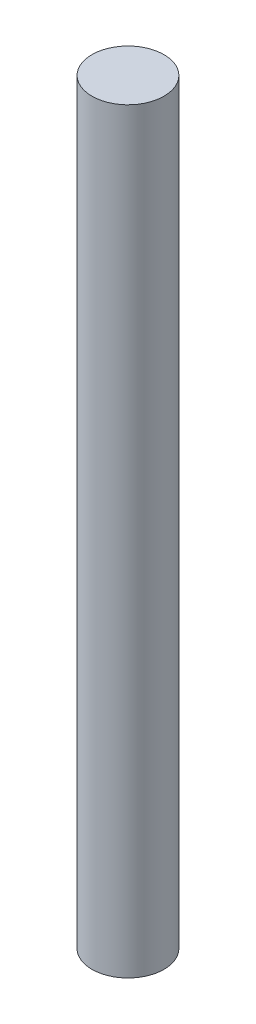
ISO-10303-21;
HEADER;
FILE_DESCRIPTION(('STEP AP214'),'2;1');
FILE_NAME('part.step','',(''),(''),'','','');
FILE_SCHEMA(('AUTOMOTIVE_DESIGN { 1 0 10303 214 1 1 1 1 }'));
ENDSEC;
DATA;
#1=APPLICATION_CONTEXT('core data for automotive mechanical design processes');
#2=APPLICATION_PROTOCOL_DEFINITION('international standard','automotive_design',2000,#1);
#3=PRODUCT_CONTEXT('',#1,'mechanical');
#4=PRODUCT('Part','Part','',(#3));
#5=PRODUCT_RELATED_PRODUCT_CATEGORY('part','',(#4));
#6=PRODUCT_DEFINITION_FORMATION('','',#4);
#7=PRODUCT_DEFINITION_CONTEXT('part definition',#1,'design');
#8=PRODUCT_DEFINITION('design','',#6,#7);
#9=PRODUCT_DEFINITION_SHAPE('','',#8);
#10=(LENGTH_UNIT() NAMED_UNIT(*) SI_UNIT(.MILLI.,.METRE.));
#11=(NAMED_UNIT(*) PLANE_ANGLE_UNIT() SI_UNIT($,.RADIAN.));
#12=(NAMED_UNIT(*) SI_UNIT($,.STERADIAN.) SOLID_ANGLE_UNIT());
#13=UNCERTAINTY_MEASURE_WITH_UNIT(LENGTH_MEASURE(1.E-05),#10,'distance_accuracy_value','');
#14=(GEOMETRIC_REPRESENTATION_CONTEXT(3) GLOBAL_UNCERTAINTY_ASSIGNED_CONTEXT((#13)) GLOBAL_UNIT_ASSIGNED_CONTEXT((#10,
#11,#12)) REPRESENTATION_CONTEXT('',''));
#15=CARTESIAN_POINT('',(0.,0.,0.));
#16=DIRECTION('',(0.,0.,1.));
#17=DIRECTION('',(1.,0.,0.));
#18=AXIS2_PLACEMENT_3D('',#15,#16,#17);
#19=CARTESIAN_POINT('',(0.,-50.,0.));
#20=DIRECTION('',(0.,1.,0.));
#21=DIRECTION('',(0.,0.,1.));
#22=AXIS2_PLACEMENT_3D('',#19,#20,#21);
#23=CYLINDRICAL_SURFACE('',#22,4.7625);
#24=CARTESIAN_POINT('',(0.,-50.,0.));
#25=DIRECTION('',(0.,1.,0.));
#26=DIRECTION('',(0.,0.,1.));
#27=AXIS2_PLACEMENT_3D('',#24,#25,#26);
#28=CIRCLE('',#27,4.7625);
#29=CARTESIAN_POINT('',(0.,-50.,4.7625));
#30=VERTEX_POINT('',#29);
#31=EDGE_CURVE('E10',#30,#30,#28,.T.);
#32=ORIENTED_EDGE('',*,*,#31,.T.);
#33=EDGE_LOOP('',(#32));
#34=FACE_BOUND('',#33,.T.);
#35=CARTESIAN_POINT('',(0.,50.,0.));
#36=DIRECTION('',(0.,1.,0.));
#37=DIRECTION('',(0.,0.,1.));
#38=AXIS2_PLACEMENT_3D('',#35,#36,#37);
#39=CIRCLE('',#38,4.7625);
#40=CARTESIAN_POINT('',(0.,50.,4.7625));
#41=VERTEX_POINT('',#40);
#42=EDGE_CURVE('E37',#41,#41,#39,.T.);
#43=ORIENTED_EDGE('',*,*,#42,.F.);
#44=EDGE_LOOP('',(#43));
#45=FACE_BOUND('',#44,.T.);
#46=ADVANCED_FACE('F31',(#34,#45),#23,.T.);
#47=CARTESIAN_POINT('',(0.,-50.,0.));
#48=DIRECTION('',(0.,1.,0.));
#49=DIRECTION('',(0.,0.,1.));
#50=AXIS2_PLACEMENT_3D('',#47,#48,#49);
#51=PLANE('',#50);
#52=ORIENTED_EDGE('',*,*,#31,.F.);
#53=EDGE_LOOP('',(#52));
#54=FACE_BOUND('',#53,.T.);
#55=ADVANCED_FACE('F46',(#54),#51,.F.);
#56=CARTESIAN_POINT('',(0.,50.,0.));
#57=DIRECTION('',(0.,1.,0.));
#58=DIRECTION('',(0.,0.,1.));
#59=AXIS2_PLACEMENT_3D('',#56,#57,#58);
#60=PLANE('',#59);
#61=ORIENTED_EDGE('',*,*,#42,.T.);
#62=EDGE_LOOP('',(#61));
#63=FACE_BOUND('',#62,.T.);
#64=ADVANCED_FACE('F43',(#63),#60,.T.);
#65=CLOSED_SHELL('',(#46,#55,#64));
#66=MANIFOLD_SOLID_BREP('B2',#65);
#67=ADVANCED_BREP_SHAPE_REPRESENTATION('',(#18,#66),#14);
#68=SHAPE_DEFINITION_REPRESENTATION(#9,#67);
ENDSEC;
END-ISO-10303-21;
